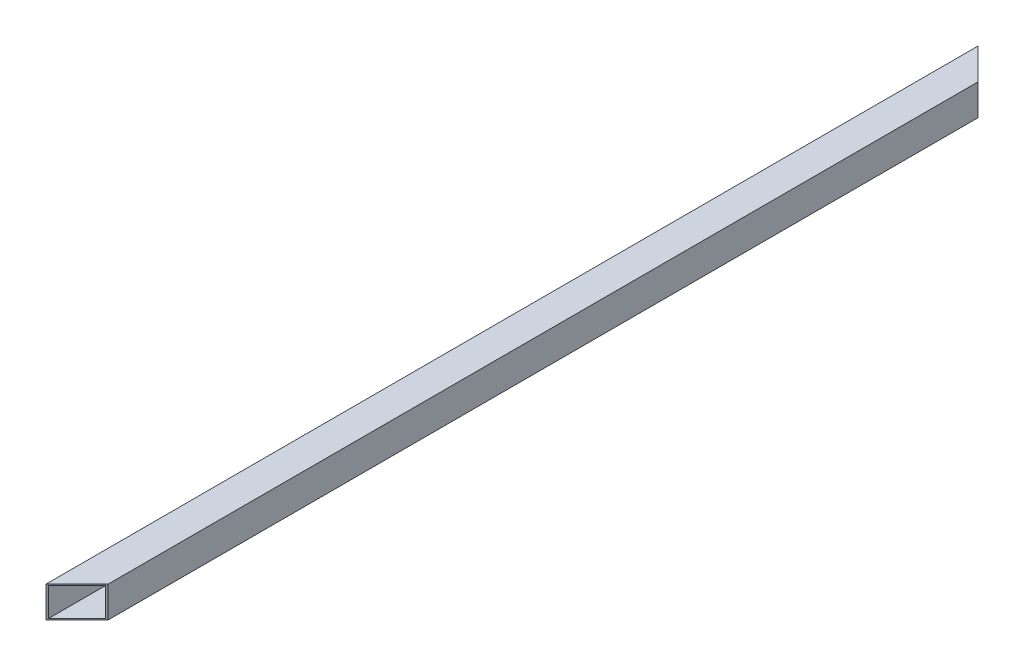
ISO-10303-21;
HEADER;
FILE_DESCRIPTION(('STEP AP214'),'2;1');
FILE_NAME('part.step','',(''),(''),'','','');
FILE_SCHEMA(('AUTOMOTIVE_DESIGN { 1 0 10303 214 1 1 1 1 }'));
ENDSEC;
DATA;
#1=APPLICATION_CONTEXT('core data for automotive mechanical design processes');
#2=APPLICATION_PROTOCOL_DEFINITION('international standard','automotive_design',2000,#1);
#3=PRODUCT_CONTEXT('',#1,'mechanical');
#4=PRODUCT('Part','Part','',(#3));
#5=PRODUCT_RELATED_PRODUCT_CATEGORY('part','',(#4));
#6=PRODUCT_DEFINITION_FORMATION('','',#4);
#7=PRODUCT_DEFINITION_CONTEXT('part definition',#1,'design');
#8=PRODUCT_DEFINITION('design','',#6,#7);
#9=PRODUCT_DEFINITION_SHAPE('','',#8);
#10=(LENGTH_UNIT() NAMED_UNIT(*) SI_UNIT(.MILLI.,.METRE.));
#11=(NAMED_UNIT(*) PLANE_ANGLE_UNIT() SI_UNIT($,.RADIAN.));
#12=(NAMED_UNIT(*) SI_UNIT($,.STERADIAN.) SOLID_ANGLE_UNIT());
#13=UNCERTAINTY_MEASURE_WITH_UNIT(LENGTH_MEASURE(1.E-05),#10,'distance_accuracy_value','');
#14=(GEOMETRIC_REPRESENTATION_CONTEXT(3) GLOBAL_UNCERTAINTY_ASSIGNED_CONTEXT((#13)) GLOBAL_UNIT_ASSIGNED_CONTEXT((#10,
#11,#12)) REPRESENTATION_CONTEXT('',''));
#15=CARTESIAN_POINT('',(0.,0.,0.));
#16=DIRECTION('',(0.,0.,1.));
#17=DIRECTION('',(1.,0.,0.));
#18=AXIS2_PLACEMENT_3D('',#15,#16,#17);
#19=CARTESIAN_POINT('',(-69.6345131491878,-40.2309443507589,3000.));
#20=DIRECTION('',(0.,1.,0.));
#21=DIRECTION('',(0.,0.,1.));
#22=AXIS2_PLACEMENT_3D('',#19,#20,#21);
#23=PLANE('',#22);
#24=DIRECTION('',(0.,0.,-1.));
#25=VECTOR('',#24,1.);
#26=CARTESIAN_POINT('',(30.3654868508122,-40.2309443507589,3000.));
#27=LINE('',#26,#25);
#28=CARTESIAN_POINT('',(30.3654868508122,-40.2309443507589,2900.));
#29=VERTEX_POINT('',#28);
#30=CARTESIAN_POINT('',(30.3654868508121,-40.2309443507589,99.9999999999973));
#31=VERTEX_POINT('',#30);
#32=EDGE_CURVE('E117',#29,#31,#27,.T.);
#33=ORIENTED_EDGE('',*,*,#32,.F.);
#34=DIRECTION('',(-0.707106781186547,0.,0.707106781186548));
#35=VECTOR('',#34,1.);
#36=CARTESIAN_POINT('',(-69.6345131491878,-40.2309443507589,3000.));
#37=LINE('',#36,#35);
#38=CARTESIAN_POINT('',(-69.6345131491878,-40.2309443507589,3000.));
#39=VERTEX_POINT('',#38);
#40=EDGE_CURVE('E101',#29,#39,#37,.T.);
#41=ORIENTED_EDGE('',*,*,#40,.T.);
#42=DIRECTION('',(0.,0.,-1.));
#43=VECTOR('',#42,1.);
#44=CARTESIAN_POINT('',(-69.6345131491878,-40.2309443507589,3000.));
#45=LINE('',#44,#43);
#46=CARTESIAN_POINT('',(-69.6345131491878,-40.2309443507589,0.));
#47=VERTEX_POINT('',#46);
#48=EDGE_CURVE('E40',#39,#47,#45,.T.);
#49=ORIENTED_EDGE('',*,*,#48,.T.);
#50=DIRECTION('',(-0.707106781186556,0.,-0.707106781186539));
#51=VECTOR('',#50,1.);
#52=CARTESIAN_POINT('',(1430.36548685081,-40.2309443507589,1499.99999999996));
#53=LINE('',#52,#51);
#54=EDGE_CURVE('E133',#31,#47,#53,.T.);
#55=ORIENTED_EDGE('',*,*,#54,.F.);
#56=EDGE_LOOP('',(#33,#41,#49,#55));
#57=FACE_BOUND('',#56,.T.);
#58=ADVANCED_FACE('F32',(#57),#23,.F.);
#59=CARTESIAN_POINT('',(30.3654868508122,59.7690556492411,3000.));
#60=DIRECTION('',(-1.,0.,0.));
#61=DIRECTION('',(0.,0.,1.));
#62=AXIS2_PLACEMENT_3D('',#59,#60,#61);
#63=PLANE('',#62);
#64=DIRECTION('',(0.,0.,-1.));
#65=VECTOR('',#64,1.);
#66=CARTESIAN_POINT('',(30.3654868508122,59.7690556492411,3000.));
#67=LINE('',#66,#65);
#68=CARTESIAN_POINT('',(30.3654868508122,59.7690556492411,2900.));
#69=VERTEX_POINT('',#68);
#70=CARTESIAN_POINT('',(30.3654868508121,59.7690556492412,99.9999999999973));
#71=VERTEX_POINT('',#70);
#72=EDGE_CURVE('E120',#69,#71,#67,.T.);
#73=ORIENTED_EDGE('',*,*,#72,.F.);
#74=DIRECTION('',(0.,1.,0.));
#75=VECTOR('',#74,1.);
#76=CARTESIAN_POINT('',(30.3654868508122,-211.230944350759,2900.));
#77=LINE('',#76,#75);
#78=EDGE_CURVE('E156',#29,#69,#77,.T.);
#79=ORIENTED_EDGE('',*,*,#78,.F.);
#80=ORIENTED_EDGE('',*,*,#32,.T.);
#81=DIRECTION('',(0.,-1.,0.));
#82=VECTOR('',#81,1.);
#83=CARTESIAN_POINT('',(30.3654868508121,468.769055649241,99.9999999999973));
#84=LINE('',#83,#82);
#85=EDGE_CURVE('E118',#71,#31,#84,.T.);
#86=ORIENTED_EDGE('',*,*,#85,.F.);
#87=EDGE_LOOP('',(#73,#79,#80,#86));
#88=FACE_BOUND('',#87,.T.);
#89=ADVANCED_FACE('F163',(#88),#63,.F.);
#90=CARTESIAN_POINT('',(-69.6345131491878,59.7690556492411,3000.));
#91=DIRECTION('',(0.,-1.,0.));
#92=DIRECTION('',(0.,0.,-1.));
#93=AXIS2_PLACEMENT_3D('',#90,#91,#92);
#94=PLANE('',#93);
#95=DIRECTION('',(0.,0.,-1.));
#96=VECTOR('',#95,1.);
#97=CARTESIAN_POINT('',(-69.6345131491878,59.7690556492411,3000.));
#98=LINE('',#97,#96);
#99=CARTESIAN_POINT('',(-69.6345131491878,59.7690556492411,3000.));
#100=VERTEX_POINT('',#99);
#101=CARTESIAN_POINT('',(-69.6345131491878,59.7690556492411,0.));
#102=VERTEX_POINT('',#101);
#103=EDGE_CURVE('E109',#100,#102,#98,.T.);
#104=ORIENTED_EDGE('',*,*,#103,.F.);
#105=DIRECTION('',(0.707106781186547,0.,-0.707106781186548));
#106=VECTOR('',#105,1.);
#107=CARTESIAN_POINT('',(-69.6345131491878,59.7690556492411,3000.));
#108=LINE('',#107,#106);
#109=EDGE_CURVE('E104',#100,#69,#108,.T.);
#110=ORIENTED_EDGE('',*,*,#109,.T.);
#111=ORIENTED_EDGE('',*,*,#72,.T.);
#112=DIRECTION('',(0.707106781186556,0.,0.707106781186539));
#113=VECTOR('',#112,1.);
#114=CARTESIAN_POINT('',(1430.36548685081,59.7690556492411,1499.99999999996));
#115=LINE('',#114,#113);
#116=EDGE_CURVE('E135',#102,#71,#115,.T.);
#117=ORIENTED_EDGE('',*,*,#116,.F.);
#118=EDGE_LOOP('',(#104,#110,#111,#117));
#119=FACE_BOUND('',#118,.T.);
#120=ADVANCED_FACE('F160',(#119),#94,.F.);
#121=CARTESIAN_POINT('',(-65.6345131491878,55.7690556492411,3000.));
#122=DIRECTION('',(1.,0.,0.));
#123=DIRECTION('',(0.,1.,0.));
#124=AXIS2_PLACEMENT_3D('',#121,#122,#123);
#125=PLANE('',#124);
#126=DIRECTION('',(0.,1.,0.));
#127=VECTOR('',#126,1.);
#128=CARTESIAN_POINT('',(-65.6345131491878,55.7690556492411,2996.));
#129=LINE('',#128,#127);
#130=CARTESIAN_POINT('',(-65.6345131491878,-36.2309443507589,2996.));
#131=VERTEX_POINT('',#130);
#132=CARTESIAN_POINT('',(-65.6345131491877,55.7690556492411,2996.));
#133=VERTEX_POINT('',#132);
#134=EDGE_CURVE('E47',#131,#133,#129,.T.);
#135=ORIENTED_EDGE('',*,*,#134,.F.);
#136=DIRECTION('',(0.,0.,-1.));
#137=VECTOR('',#136,1.);
#138=CARTESIAN_POINT('',(-65.6345131491878,-36.2309443507589,3000.));
#139=LINE('',#138,#137);
#140=CARTESIAN_POINT('',(-65.6345131491876,-36.2309443507589,4.));
#141=VERTEX_POINT('',#140);
#142=EDGE_CURVE('E125',#131,#141,#139,.T.);
#143=ORIENTED_EDGE('',*,*,#142,.T.);
#144=DIRECTION('',(0.,1.,0.));
#145=VECTOR('',#144,1.);
#146=CARTESIAN_POINT('',(-65.6345131491878,55.7690556492407,4.));
#147=LINE('',#146,#145);
#148=CARTESIAN_POINT('',(-65.6345131491876,55.7690556492411,4.));
#149=VERTEX_POINT('',#148);
#150=EDGE_CURVE('E138',#141,#149,#147,.T.);
#151=ORIENTED_EDGE('',*,*,#150,.T.);
#152=DIRECTION('',(0.,0.,-1.));
#153=VECTOR('',#152,1.);
#154=CARTESIAN_POINT('',(-65.6345131491878,55.7690556492411,3000.));
#155=LINE('',#154,#153);
#156=EDGE_CURVE('E131',#133,#149,#155,.T.);
#157=ORIENTED_EDGE('',*,*,#156,.F.);
#158=EDGE_LOOP('',(#135,#143,#151,#157));
#159=FACE_BOUND('',#158,.T.);
#160=ADVANCED_FACE('F185',(#159),#125,.T.);
#161=CARTESIAN_POINT('',(-65.6345131491878,-36.2309443507589,3000.));
#162=DIRECTION('',(0.,1.,0.));
#163=DIRECTION('',(0.,0.,1.));
#164=AXIS2_PLACEMENT_3D('',#161,#162,#163);
#165=PLANE('',#164);
#166=DIRECTION('',(-0.707106781186547,0.,0.707106781186548));
#167=VECTOR('',#166,1.);
#168=CARTESIAN_POINT('',(-67.6345131491878,-36.2309443507589,2998.));
#169=LINE('',#168,#167);
#170=CARTESIAN_POINT('',(26.3654868508122,-36.2309443507589,2904.));
#171=VERTEX_POINT('',#170);
#172=EDGE_CURVE('E150',#171,#131,#169,.T.);
#173=ORIENTED_EDGE('',*,*,#172,.F.);
#174=DIRECTION('',(0.,0.,-1.));
#175=VECTOR('',#174,1.);
#176=CARTESIAN_POINT('',(26.3654868508122,-36.2309443507589,3000.));
#177=LINE('',#176,#175);
#178=CARTESIAN_POINT('',(26.3654868508122,-36.2309443507589,95.9999999999979));
#179=VERTEX_POINT('',#178);
#180=EDGE_CURVE('E128',#171,#179,#177,.T.);
#181=ORIENTED_EDGE('',*,*,#180,.T.);
#182=DIRECTION('',(-0.707106781186556,0.,-0.707106781186539));
#183=VECTOR('',#182,1.);
#184=CARTESIAN_POINT('',(1432.36548685081,-36.2309443507589,1501.99999999996));
#185=LINE('',#184,#183);
#186=EDGE_CURVE('E141',#179,#141,#185,.T.);
#187=ORIENTED_EDGE('',*,*,#186,.T.);
#188=ORIENTED_EDGE('',*,*,#142,.F.);
#189=EDGE_LOOP('',(#173,#181,#187,#188));
#190=FACE_BOUND('',#189,.T.);
#191=ADVANCED_FACE('F188',(#190),#165,.T.);
#192=CARTESIAN_POINT('',(26.3654868508122,55.7690556492411,3000.));
#193=DIRECTION('',(-1.,0.,0.));
#194=DIRECTION('',(0.,0.,1.));
#195=AXIS2_PLACEMENT_3D('',#192,#193,#194);
#196=PLANE('',#195);
#197=DIRECTION('',(0.,-1.,0.));
#198=VECTOR('',#197,1.);
#199=CARTESIAN_POINT('',(26.3654868508122,55.7690556492411,2904.));
#200=LINE('',#199,#198);
#201=CARTESIAN_POINT('',(26.3654868508122,55.7690556492411,2904.));
#202=VERTEX_POINT('',#201);
#203=EDGE_CURVE('E152',#202,#171,#200,.T.);
#204=ORIENTED_EDGE('',*,*,#203,.F.);
#205=DIRECTION('',(0.,0.,-1.));
#206=VECTOR('',#205,1.);
#207=CARTESIAN_POINT('',(26.3654868508122,55.7690556492411,3000.));
#208=LINE('',#207,#206);
#209=CARTESIAN_POINT('',(26.3654868508123,55.7690556492411,95.9999999999978));
#210=VERTEX_POINT('',#209);
#211=EDGE_CURVE('E55',#202,#210,#208,.T.);
#212=ORIENTED_EDGE('',*,*,#211,.T.);
#213=DIRECTION('',(0.,-1.,0.));
#214=VECTOR('',#213,1.);
#215=CARTESIAN_POINT('',(26.3654868508122,55.7690556492411,95.9999999999979));
#216=LINE('',#215,#214);
#217=EDGE_CURVE('E144',#210,#179,#216,.T.);
#218=ORIENTED_EDGE('',*,*,#217,.T.);
#219=ORIENTED_EDGE('',*,*,#180,.F.);
#220=EDGE_LOOP('',(#204,#212,#218,#219));
#221=FACE_BOUND('',#220,.T.);
#222=ADVANCED_FACE('F192',(#221),#196,.T.);
#223=CARTESIAN_POINT('',(-65.6345131491878,55.7690556492411,3000.));
#224=DIRECTION('',(0.,-1.,0.));
#225=DIRECTION('',(0.,0.,-1.));
#226=AXIS2_PLACEMENT_3D('',#223,#224,#225);
#227=PLANE('',#226);
#228=DIRECTION('',(0.707106781186547,0.,-0.707106781186548));
#229=VECTOR('',#228,1.);
#230=CARTESIAN_POINT('',(-67.6345131491878,55.7690556492411,2998.));
#231=LINE('',#230,#229);
#232=EDGE_CURVE('E154',#133,#202,#231,.T.);
#233=ORIENTED_EDGE('',*,*,#232,.F.);
#234=ORIENTED_EDGE('',*,*,#156,.T.);
#235=DIRECTION('',(0.707106781186556,0.,0.707106781186539));
#236=VECTOR('',#235,1.);
#237=CARTESIAN_POINT('',(1432.36548685081,55.7690556492411,1501.99999999996));
#238=LINE('',#237,#236);
#239=EDGE_CURVE('E11',#149,#210,#238,.T.);
#240=ORIENTED_EDGE('',*,*,#239,.T.);
#241=ORIENTED_EDGE('',*,*,#211,.F.);
#242=EDGE_LOOP('',(#233,#234,#240,#241));
#243=FACE_BOUND('',#242,.T.);
#244=ADVANCED_FACE('F174',(#243),#227,.T.);
#245=CARTESIAN_POINT('',(-69.6345131491878,59.7690556492411,3000.));
#246=DIRECTION('',(1.,0.,0.));
#247=DIRECTION('',(0.,1.,0.));
#248=AXIS2_PLACEMENT_3D('',#245,#246,#247);
#249=PLANE('',#248);
#250=DIRECTION('',(0.,-1.,0.));
#251=VECTOR('',#250,1.);
#252=CARTESIAN_POINT('',(-69.6345131491878,59.7690556492411,0.));
#253=LINE('',#252,#251);
#254=EDGE_CURVE('E110',#102,#47,#253,.T.);
#255=ORIENTED_EDGE('',*,*,#254,.T.);
#256=ORIENTED_EDGE('',*,*,#48,.F.);
#257=DIRECTION('',(0.,-1.,0.));
#258=VECTOR('',#257,1.);
#259=CARTESIAN_POINT('',(-69.6345131491878,59.7690556492411,3000.));
#260=LINE('',#259,#258);
#261=EDGE_CURVE('E98',#100,#39,#260,.T.);
#262=ORIENTED_EDGE('',*,*,#261,.F.);
#263=ORIENTED_EDGE('',*,*,#103,.T.);
#264=EDGE_LOOP('',(#255,#256,#262,#263));
#265=FACE_BOUND('',#264,.T.);
#266=ADVANCED_FACE('F34',(#265),#249,.F.);
#267=CARTESIAN_POINT('',(-69.6345131491878,468.769055649241,0.));
#268=DIRECTION('',(0.707106781186539,0.,-0.707106781186556));
#269=DIRECTION('',(-0.707106781186556,0.,-0.707106781186539));
#270=AXIS2_PLACEMENT_3D('',#267,#268,#269);
#271=PLANE('',#270);
#272=ORIENTED_EDGE('',*,*,#186,.F.);
#273=ORIENTED_EDGE('',*,*,#217,.F.);
#274=ORIENTED_EDGE('',*,*,#239,.F.);
#275=ORIENTED_EDGE('',*,*,#150,.F.);
#276=EDGE_LOOP('',(#272,#273,#274,#275));
#277=FACE_BOUND('',#276,.T.);
#278=ORIENTED_EDGE('',*,*,#54,.T.);
#279=ORIENTED_EDGE('',*,*,#254,.F.);
#280=ORIENTED_EDGE('',*,*,#116,.T.);
#281=ORIENTED_EDGE('',*,*,#85,.T.);
#282=EDGE_LOOP('',(#278,#279,#280,#281));
#283=FACE_BOUND('',#282,.T.);
#284=ADVANCED_FACE('F165',(#277,#283),#271,.T.);
#285=CARTESIAN_POINT('',(-69.6345131491878,-211.230944350759,3000.));
#286=DIRECTION('',(-0.707106781186548,0.,-0.707106781186547));
#287=DIRECTION('',(-0.707106781186547,0.,0.707106781186548));
#288=AXIS2_PLACEMENT_3D('',#285,#286,#287);
#289=PLANE('',#288);
#290=ORIENTED_EDGE('',*,*,#134,.T.);
#291=ORIENTED_EDGE('',*,*,#232,.T.);
#292=ORIENTED_EDGE('',*,*,#203,.T.);
#293=ORIENTED_EDGE('',*,*,#172,.T.);
#294=EDGE_LOOP('',(#290,#291,#292,#293));
#295=FACE_BOUND('',#294,.T.);
#296=ORIENTED_EDGE('',*,*,#78,.T.);
#297=ORIENTED_EDGE('',*,*,#109,.F.);
#298=ORIENTED_EDGE('',*,*,#261,.T.);
#299=ORIENTED_EDGE('',*,*,#40,.F.);
#300=EDGE_LOOP('',(#296,#297,#298,#299));
#301=FACE_BOUND('',#300,.T.);
#302=ADVANCED_FACE('F100',(#295,#301),#289,.F.);
#303=CLOSED_SHELL('',(#58,#89,#120,#160,#191,#222,#244,#266,#284,#302));
#304=MANIFOLD_SOLID_BREP('B2',#303);
#305=ADVANCED_BREP_SHAPE_REPRESENTATION('',(#18,#304),#14);
#306=SHAPE_DEFINITION_REPRESENTATION(#9,#305);
ENDSEC;
END-ISO-10303-21;
